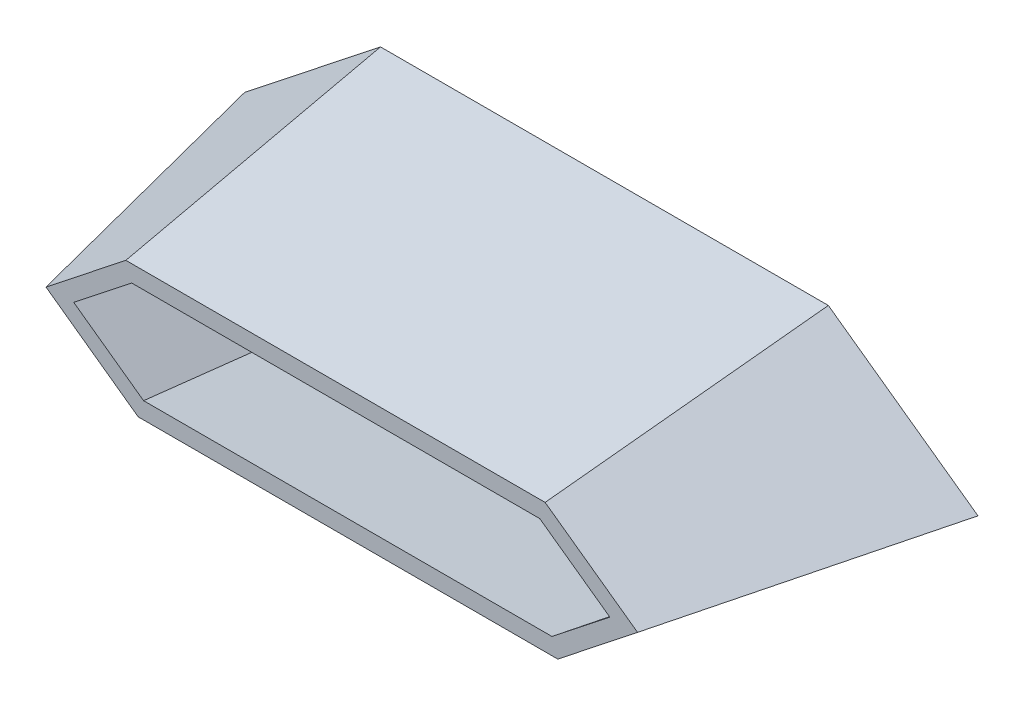
ISO-10303-21;
HEADER;
FILE_DESCRIPTION(('STEP AP214'),'2;1');
FILE_NAME('part.step','',(''),(''),'','','');
FILE_SCHEMA(('AUTOMOTIVE_DESIGN { 1 0 10303 214 1 1 1 1 }'));
ENDSEC;
DATA;
#1=APPLICATION_CONTEXT('core data for automotive mechanical design processes');
#2=APPLICATION_PROTOCOL_DEFINITION('international standard','automotive_design',2000,#1);
#3=PRODUCT_CONTEXT('',#1,'mechanical');
#4=PRODUCT('Part','Part','',(#3));
#5=PRODUCT_RELATED_PRODUCT_CATEGORY('part','',(#4));
#6=PRODUCT_DEFINITION_FORMATION('','',#4);
#7=PRODUCT_DEFINITION_CONTEXT('part definition',#1,'design');
#8=PRODUCT_DEFINITION('design','',#6,#7);
#9=PRODUCT_DEFINITION_SHAPE('','',#8);
#10=(LENGTH_UNIT() NAMED_UNIT(*) SI_UNIT(.MILLI.,.METRE.));
#11=(NAMED_UNIT(*) PLANE_ANGLE_UNIT() SI_UNIT($,.RADIAN.));
#12=(NAMED_UNIT(*) SI_UNIT($,.STERADIAN.) SOLID_ANGLE_UNIT());
#13=UNCERTAINTY_MEASURE_WITH_UNIT(LENGTH_MEASURE(1.E-05),#10,'distance_accuracy_value','');
#14=(GEOMETRIC_REPRESENTATION_CONTEXT(3) GLOBAL_UNCERTAINTY_ASSIGNED_CONTEXT((#13)) GLOBAL_UNIT_ASSIGNED_CONTEXT((#10,
#11,#12)) REPRESENTATION_CONTEXT('',''));
#15=CARTESIAN_POINT('',(0.,0.,0.));
#16=DIRECTION('',(0.,0.,1.));
#17=DIRECTION('',(1.,0.,0.));
#18=AXIS2_PLACEMENT_3D('',#15,#16,#17);
#19=CARTESIAN_POINT('',(0.,0.,14.6));
#20=DIRECTION('',(0.,0.,1.));
#21=DIRECTION('',(1.,0.,0.));
#22=AXIS2_PLACEMENT_3D('',#19,#20,#21);
#23=PLANE('',#22);
#24=DIRECTION('',(-0.784634745814211,-0.619958317680365,0.));
#25=VECTOR('',#24,1.);
#26=CARTESIAN_POINT('',(-10.7814587846776,3.07737881996656,14.6));
#27=LINE('',#26,#25);
#28=CARTESIAN_POINT('',(-11.3858542995684,2.59983174647262,14.6));
#29=VERTEX_POINT('',#28);
#30=CARTESIAN_POINT('',(-14.523223102529,0.120923062651897,14.6));
#31=VERTEX_POINT('',#30);
#32=EDGE_CURVE('E358',#29,#31,#27,.T.);
#33=ORIENTED_EDGE('',*,*,#32,.F.);
#34=DIRECTION('',(-1.,0.,0.));
#35=VECTOR('',#34,1.);
#36=CARTESIAN_POINT('',(11.4365663707456,2.59983174647262,14.6));
#37=LINE('',#36,#35);
#38=CARTESIAN_POINT('',(10.7233829470702,2.59983174647262,14.6));
#39=VERTEX_POINT('',#38);
#40=EDGE_CURVE('E354',#39,#29,#37,.T.);
#41=ORIENTED_EDGE('',*,*,#40,.F.);
#42=DIRECTION('',(-0.812500733959519,0.582960167863331,0.));
#43=VECTOR('',#42,1.);
#44=CARTESIAN_POINT('',(16.9115645353516,-1.84011916888623,14.6));
#45=LINE('',#44,#43);
#46=CARTESIAN_POINT('',(14.5195166433071,-0.12385162302473,14.6));
#47=VERTEX_POINT('',#46);
#48=EDGE_CURVE('E372',#47,#39,#45,.T.);
#49=ORIENTED_EDGE('',*,*,#48,.F.);
#50=DIRECTION('',(0.78463474581421,0.619958317680366,0.));
#51=VECTOR('',#50,1.);
#52=CARTESIAN_POINT('',(10.7814587846776,-3.07737881996657,14.6));
#53=LINE('',#52,#51);
#54=CARTESIAN_POINT('',(11.3858542995684,-2.59983174647262,14.6));
#55=VERTEX_POINT('',#54);
#56=EDGE_CURVE('E390',#55,#47,#53,.T.);
#57=ORIENTED_EDGE('',*,*,#56,.F.);
#58=DIRECTION('',(1.,0.,0.));
#59=VECTOR('',#58,1.);
#60=CARTESIAN_POINT('',(-11.4541582602206,-2.59983174647262,14.6));
#61=LINE('',#60,#59);
#62=CARTESIAN_POINT('',(-10.7396734460902,-2.59983174647262,14.6));
#63=VERTEX_POINT('',#62);
#64=EDGE_CURVE('E394',#63,#55,#61,.T.);
#65=ORIENTED_EDGE('',*,*,#64,.F.);
#66=DIRECTION('',(0.811880248653877,-0.583823999032001,0.));
#67=VECTOR('',#66,1.);
#68=CARTESIAN_POINT('',(-16.9108011023936,1.83783308502642,14.6));
#69=LINE('',#68,#67);
#70=EDGE_CURVE('E397',#31,#63,#69,.T.);
#71=ORIENTED_EDGE('',*,*,#70,.F.);
#72=EDGE_LOOP('',(#33,#41,#49,#57,#65,#71));
#73=FACE_BOUND('',#72,.T.);
#74=DIRECTION('',(-0.78463474581421,-0.619958317680366,0.));
#75=VECTOR('',#74,1.);
#76=CARTESIAN_POINT('',(6.20184152021513,-7.84920567402225,14.6));
#77=LINE('',#76,#75);
#78=CARTESIAN_POINT('',(11.7002285816416,-3.5048010822779,14.6));
#79=VERTEX_POINT('',#78);
#80=CARTESIAN_POINT('',(16.0233325239582,-0.0890152513116378,14.6));
#81=VERTEX_POINT('',#80);
#82=EDGE_CURVE('E290',#79,#81,#77,.F.);
#83=ORIENTED_EDGE('',*,*,#82,.T.);
#84=DIRECTION('',(0.812500733959519,-0.582960167863331,0.));
#85=VECTOR('',#84,1.);
#86=CARTESIAN_POINT('',(5.40324773256688,7.5307765272651,14.6));
#87=LINE('',#86,#85);
#88=CARTESIAN_POINT('',(11.0144510090178,3.5048010822779,14.6));
#89=VERTEX_POINT('',#88);
#90=EDGE_CURVE('E12',#81,#89,#87,.F.);
#91=ORIENTED_EDGE('',*,*,#90,.T.);
#92=DIRECTION('',(1.,0.,0.));
#93=VECTOR('',#92,1.);
#94=CARTESIAN_POINT('',(0.,3.5048010822779,14.6));
#95=LINE('',#94,#93);
#96=CARTESIAN_POINT('',(-11.7002285816416,3.50480108227789,14.6));
#97=VERTEX_POINT('',#96);
#98=EDGE_CURVE('E184',#89,#97,#95,.F.);
#99=ORIENTED_EDGE('',*,*,#98,.T.);
#100=DIRECTION('',(0.784634745814211,0.619958317680365,0.));
#101=VECTOR('',#100,1.);
#102=CARTESIAN_POINT('',(-6.20184152021511,7.84920567402224,14.6));
#103=LINE('',#102,#101);
#104=CARTESIAN_POINT('',(-16.0259964486695,0.0869104219101166,14.6));
#105=VERTEX_POINT('',#104);
#106=EDGE_CURVE('E339',#97,#105,#103,.F.);
#107=ORIENTED_EDGE('',*,*,#106,.T.);
#108=DIRECTION('',(-0.811880248653877,0.583823999032001,0.));
#109=VECTOR('',#108,1.);
#110=CARTESIAN_POINT('',(-5.42127317055424,-7.53895800280199,14.6));
#111=LINE('',#110,#109);
#112=CARTESIAN_POINT('',(-11.0312726381581,-3.5048010822779,14.6));
#113=VERTEX_POINT('',#112);
#114=EDGE_CURVE('E335',#105,#113,#111,.F.);
#115=ORIENTED_EDGE('',*,*,#114,.T.);
#116=DIRECTION('',(-1.,0.,0.));
#117=VECTOR('',#116,1.);
#118=CARTESIAN_POINT('',(0.,-3.5048010822779,14.6));
#119=LINE('',#118,#117);
#120=EDGE_CURVE('E332',#113,#79,#119,.F.);
#121=ORIENTED_EDGE('',*,*,#120,.T.);
#122=EDGE_LOOP('',(#83,#91,#99,#107,#115,#121));
#123=FACE_BOUND('',#122,.T.);
#124=ADVANCED_FACE('F175',(#73,#123),#23,.T.);
#125=CARTESIAN_POINT('',(0.,0.,0.));
#126=DIRECTION('',(0.,0.,-1.));
#127=DIRECTION('',(-1.,0.,0.));
#128=AXIS2_PLACEMENT_3D('',#125,#126,#127);
#129=PLANE('',#128);
#130=DIRECTION('',(0.78463474581421,0.619958317680366,0.));
#131=VECTOR('',#130,1.);
#132=CARTESIAN_POINT('',(12.5035299689139,-5.81721391101613,0.));
#133=LINE('',#132,#131);
#134=CARTESIAN_POINT('',(12.5035299689139,-5.81721391101613,0.));
#135=VERTEX_POINT('',#134);
#136=CARTESIAN_POINT('',(19.8659413250437,0.,0.));
#137=VERTEX_POINT('',#136);
#138=EDGE_CURVE('E287',#135,#137,#133,.T.);
#139=ORIENTED_EDGE('',*,*,#138,.F.);
#140=DIRECTION('',(1.,0.,0.));
#141=VECTOR('',#140,1.);
#142=CARTESIAN_POINT('',(11.9236217699631,-5.81721391101613,0.));
#143=LINE('',#142,#141);
#144=CARTESIAN_POINT('',(-11.7763782300369,-5.81721391101613,0.));
#145=VERTEX_POINT('',#144);
#146=EDGE_CURVE('E298',#145,#135,#143,.T.);
#147=ORIENTED_EDGE('',*,*,#146,.F.);
#148=DIRECTION('',(0.811880248653877,-0.583823999032001,0.));
#149=VECTOR('',#148,1.);
#150=CARTESIAN_POINT('',(-19.8659413250437,0.,0.));
#151=LINE('',#150,#149);
#152=CARTESIAN_POINT('',(-19.8659413250437,0.,0.));
#153=VERTEX_POINT('',#152);
#154=EDGE_CURVE('E304',#153,#145,#151,.T.);
#155=ORIENTED_EDGE('',*,*,#154,.F.);
#156=DIRECTION('',(-0.784634745814211,-0.619958317680365,0.));
#157=VECTOR('',#156,1.);
#158=CARTESIAN_POINT('',(-12.5035299689139,5.81721391101613,0.));
#159=LINE('',#158,#157);
#160=CARTESIAN_POINT('',(-12.5035299689139,5.81721391101613,0.));
#161=VERTEX_POINT('',#160);
#162=EDGE_CURVE('E324',#161,#153,#159,.T.);
#163=ORIENTED_EDGE('',*,*,#162,.F.);
#164=DIRECTION('',(-1.,0.,0.));
#165=VECTOR('',#164,1.);
#166=CARTESIAN_POINT('',(11.758199436565,5.81721391101613,0.));
#167=LINE('',#166,#165);
#168=CARTESIAN_POINT('',(11.758199436565,5.81721391101613,0.));
#169=VERTEX_POINT('',#168);
#170=EDGE_CURVE('E315',#169,#161,#167,.T.);
#171=ORIENTED_EDGE('',*,*,#170,.F.);
#172=DIRECTION('',(-0.812500733959519,0.582960167863331,0.));
#173=VECTOR('',#172,1.);
#174=CARTESIAN_POINT('',(19.8659413250437,0.,0.));
#175=LINE('',#174,#173);
#176=EDGE_CURVE('E309',#137,#169,#175,.T.);
#177=ORIENTED_EDGE('',*,*,#176,.F.);
#178=EDGE_LOOP('',(#139,#147,#155,#163,#171,#177));
#179=FACE_BOUND('',#178,.T.);
#180=DIRECTION('',(1.,0.,0.));
#181=VECTOR('',#180,1.);
#182=CARTESIAN_POINT('',(0.,-4.81721391101613,0.));
#183=LINE('',#182,#181);
#184=CARTESIAN_POINT('',(-11.4541582602206,-4.81721391101613,0.));
#185=VERTEX_POINT('',#184);
#186=CARTESIAN_POINT('',(12.1561433010625,-4.81721391101613,0.));
#187=VERTEX_POINT('',#186);
#188=EDGE_CURVE('E407',#185,#187,#183,.T.);
#189=ORIENTED_EDGE('',*,*,#188,.T.);
#190=DIRECTION('',(0.784634745814211,0.619958317680366,0.));
#191=VECTOR('',#190,1.);
#192=CARTESIAN_POINT('',(7.01548276962181,-8.87897038030258,0.));
#193=LINE('',#192,#191);
#194=CARTESIAN_POINT('',(18.204210014211,-0.0384945327258834,0.));
#195=VERTEX_POINT('',#194);
#196=EDGE_CURVE('E199',#187,#195,#193,.T.);
#197=ORIENTED_EDGE('',*,*,#196,.T.);
#198=DIRECTION('',(-0.812500733959519,0.582960167863331,0.));
#199=VECTOR('',#198,1.);
#200=CARTESIAN_POINT('',(6.16833213551411,8.5971129138728,0.));
#201=LINE('',#200,#199);
#202=CARTESIAN_POINT('',(11.4365663707456,4.81721391101613,0.));
#203=VERTEX_POINT('',#202);
#204=EDGE_CURVE('E430',#195,#203,#201,.T.);
#205=ORIENTED_EDGE('',*,*,#204,.T.);
#206=DIRECTION('',(-1.,0.,0.));
#207=VECTOR('',#206,1.);
#208=CARTESIAN_POINT('',(0.,4.81721391101613,0.));
#209=LINE('',#208,#207);
#210=CARTESIAN_POINT('',(-12.1561433010625,4.81721391101613,0.));
#211=VERTEX_POINT('',#210);
#212=EDGE_CURVE('E434',#203,#211,#209,.T.);
#213=ORIENTED_EDGE('',*,*,#212,.T.);
#214=DIRECTION('',(-0.784634745814211,-0.619958317680365,0.));
#215=VECTOR('',#214,1.);
#216=CARTESIAN_POINT('',(-7.01548276962179,8.87897038030258,0.));
#217=LINE('',#216,#215);
#218=CARTESIAN_POINT('',(-18.2053620250796,0.0375843019161658,0.));
#219=VERTEX_POINT('',#218);
#220=EDGE_CURVE('E438',#211,#219,#217,.T.);
#221=ORIENTED_EDGE('',*,*,#220,.T.);
#222=DIRECTION('',(0.811880248653877,-0.583823999032002,0.));
#223=VECTOR('',#222,1.);
#224=CARTESIAN_POINT('',(-6.1874912766091,-8.60448005653453,0.));
#225=LINE('',#224,#223);
#226=EDGE_CURVE('E442',#219,#185,#225,.T.);
#227=ORIENTED_EDGE('',*,*,#226,.T.);
#228=EDGE_LOOP('',(#189,#197,#205,#213,#221,#227));
#229=FACE_BOUND('',#228,.T.);
#230=ADVANCED_FACE('F177',(#179,#229),#129,.T.);
#231=CARTESIAN_POINT('',(7.01548276962181,-8.87897038030258,0.6));
#232=DIRECTION('',(-0.619958317680366,0.78463474581421,0.));
#233=DIRECTION('',(-0.78463474581421,-0.619958317680366,0.));
#234=AXIS2_PLACEMENT_3D('',#231,#232,#233);
#235=PLANE('',#234);
#236=ORIENTED_EDGE('',*,*,#196,.F.);
#237=DIRECTION('',(0.,0.,-1.));
#238=VECTOR('',#237,1.);
#239=CARTESIAN_POINT('',(12.1561433010625,-4.81721391101613,0.6));
#240=LINE('',#239,#238);
#241=CARTESIAN_POINT('',(12.1561433010625,-4.81721391101613,0.6));
#242=VERTEX_POINT('',#241);
#243=EDGE_CURVE('E427',#242,#187,#240,.T.);
#244=ORIENTED_EDGE('',*,*,#243,.F.);
#245=DIRECTION('',(0.784634745814211,0.619958317680366,0.));
#246=VECTOR('',#245,1.);
#247=CARTESIAN_POINT('',(7.01548276962181,-8.87897038030258,0.6));
#248=LINE('',#247,#246);
#249=CARTESIAN_POINT('',(18.204210014211,-0.0384945327258834,0.6));
#250=VERTEX_POINT('',#249);
#251=EDGE_CURVE('E402',#242,#250,#248,.T.);
#252=ORIENTED_EDGE('',*,*,#251,.T.);
#253=DIRECTION('',(0.,0.,-1.));
#254=VECTOR('',#253,1.);
#255=CARTESIAN_POINT('',(18.204210014211,-0.0384945327258834,0.6));
#256=LINE('',#255,#254);
#257=EDGE_CURVE('E311',#250,#195,#256,.T.);
#258=ORIENTED_EDGE('',*,*,#257,.T.);
#259=EDGE_LOOP('',(#236,#244,#252,#258));
#260=FACE_BOUND('',#259,.T.);
#261=ADVANCED_FACE('F504',(#260),#235,.T.);
#262=CARTESIAN_POINT('',(6.16833213551411,8.5971129138728,0.6));
#263=DIRECTION('',(-0.582960167863331,-0.812500733959519,0.));
#264=DIRECTION('',(0.812500733959519,-0.582960167863331,0.));
#265=AXIS2_PLACEMENT_3D('',#262,#263,#264);
#266=PLANE('',#265);
#267=ORIENTED_EDGE('',*,*,#204,.F.);
#268=ORIENTED_EDGE('',*,*,#257,.F.);
#269=DIRECTION('',(-0.812500733959519,0.582960167863331,0.));
#270=VECTOR('',#269,1.);
#271=CARTESIAN_POINT('',(6.16833213551411,8.5971129138728,0.6));
#272=LINE('',#271,#270);
#273=CARTESIAN_POINT('',(11.4365663707456,4.81721391101613,0.6));
#274=VERTEX_POINT('',#273);
#275=EDGE_CURVE('E406',#250,#274,#272,.T.);
#276=ORIENTED_EDGE('',*,*,#275,.T.);
#277=DIRECTION('',(0.,0.,-1.));
#278=VECTOR('',#277,1.);
#279=CARTESIAN_POINT('',(11.4365663707456,4.81721391101613,0.6));
#280=LINE('',#279,#278);
#281=EDGE_CURVE('E317',#274,#203,#280,.T.);
#282=ORIENTED_EDGE('',*,*,#281,.T.);
#283=EDGE_LOOP('',(#267,#268,#276,#282));
#284=FACE_BOUND('',#283,.T.);
#285=ADVANCED_FACE('F464',(#284),#266,.T.);
#286=CARTESIAN_POINT('',(0.,4.81721391101613,0.6));
#287=DIRECTION('',(0.,-1.,0.));
#288=DIRECTION('',(0.,0.,-1.));
#289=AXIS2_PLACEMENT_3D('',#286,#287,#288);
#290=PLANE('',#289);
#291=ORIENTED_EDGE('',*,*,#212,.F.);
#292=ORIENTED_EDGE('',*,*,#281,.F.);
#293=DIRECTION('',(-1.,0.,0.));
#294=VECTOR('',#293,1.);
#295=CARTESIAN_POINT('',(0.,4.81721391101613,0.6));
#296=LINE('',#295,#294);
#297=CARTESIAN_POINT('',(-12.1561433010625,4.81721391101613,0.6));
#298=VERTEX_POINT('',#297);
#299=EDGE_CURVE('E411',#274,#298,#296,.T.);
#300=ORIENTED_EDGE('',*,*,#299,.T.);
#301=DIRECTION('',(0.,0.,-1.));
#302=VECTOR('',#301,1.);
#303=CARTESIAN_POINT('',(-12.1561433010625,4.81721391101613,0.6));
#304=LINE('',#303,#302);
#305=EDGE_CURVE('E458',#298,#211,#304,.T.);
#306=ORIENTED_EDGE('',*,*,#305,.T.);
#307=EDGE_LOOP('',(#291,#292,#300,#306));
#308=FACE_BOUND('',#307,.T.);
#309=ADVANCED_FACE('F468',(#308),#290,.T.);
#310=CARTESIAN_POINT('',(-7.01548276962179,8.87897038030258,0.6));
#311=DIRECTION('',(0.619958317680365,-0.784634745814211,0.));
#312=DIRECTION('',(0.784634745814211,0.619958317680365,0.));
#313=AXIS2_PLACEMENT_3D('',#310,#311,#312);
#314=PLANE('',#313);
#315=ORIENTED_EDGE('',*,*,#220,.F.);
#316=ORIENTED_EDGE('',*,*,#305,.F.);
#317=DIRECTION('',(-0.784634745814211,-0.619958317680365,0.));
#318=VECTOR('',#317,1.);
#319=CARTESIAN_POINT('',(-7.01548276962179,8.87897038030258,0.6));
#320=LINE('',#319,#318);
#321=CARTESIAN_POINT('',(-18.2053620250796,0.0375843019161658,0.6));
#322=VERTEX_POINT('',#321);
#323=EDGE_CURVE('E415',#298,#322,#320,.T.);
#324=ORIENTED_EDGE('',*,*,#323,.T.);
#325=DIRECTION('',(0.,0.,-1.));
#326=VECTOR('',#325,1.);
#327=CARTESIAN_POINT('',(-18.2053620250796,0.0375843019161658,0.6));
#328=LINE('',#327,#326);
#329=EDGE_CURVE('E455',#322,#219,#328,.T.);
#330=ORIENTED_EDGE('',*,*,#329,.T.);
#331=EDGE_LOOP('',(#315,#316,#324,#330));
#332=FACE_BOUND('',#331,.T.);
#333=ADVANCED_FACE('F486',(#332),#314,.T.);
#334=CARTESIAN_POINT('',(-6.1874912766091,-8.60448005653453,0.6));
#335=DIRECTION('',(0.583823999032001,0.811880248653877,0.));
#336=DIRECTION('',(-0.811880248653877,0.583823999032002,0.));
#337=AXIS2_PLACEMENT_3D('',#334,#335,#336);
#338=PLANE('',#337);
#339=ORIENTED_EDGE('',*,*,#226,.F.);
#340=ORIENTED_EDGE('',*,*,#329,.F.);
#341=DIRECTION('',(0.811880248653877,-0.583823999032002,0.));
#342=VECTOR('',#341,1.);
#343=CARTESIAN_POINT('',(-6.1874912766091,-8.60448005653453,0.6));
#344=LINE('',#343,#342);
#345=CARTESIAN_POINT('',(-11.4541582602206,-4.81721391101613,0.6));
#346=VERTEX_POINT('',#345);
#347=EDGE_CURVE('E419',#322,#346,#344,.T.);
#348=ORIENTED_EDGE('',*,*,#347,.T.);
#349=DIRECTION('',(0.,0.,-1.));
#350=VECTOR('',#349,1.);
#351=CARTESIAN_POINT('',(-11.4541582602206,-4.81721391101613,0.6));
#352=LINE('',#351,#350);
#353=EDGE_CURVE('E451',#346,#185,#352,.T.);
#354=ORIENTED_EDGE('',*,*,#353,.T.);
#355=EDGE_LOOP('',(#339,#340,#348,#354));
#356=FACE_BOUND('',#355,.T.);
#357=ADVANCED_FACE('F476',(#356),#338,.T.);
#358=CARTESIAN_POINT('',(0.,-4.81721391101613,0.6));
#359=DIRECTION('',(0.,1.,0.));
#360=DIRECTION('',(0.,0.,1.));
#361=AXIS2_PLACEMENT_3D('',#358,#359,#360);
#362=PLANE('',#361);
#363=ORIENTED_EDGE('',*,*,#188,.F.);
#364=ORIENTED_EDGE('',*,*,#353,.F.);
#365=DIRECTION('',(1.,0.,0.));
#366=VECTOR('',#365,1.);
#367=CARTESIAN_POINT('',(0.,-4.81721391101613,0.6));
#368=LINE('',#367,#366);
#369=EDGE_CURVE('E423',#346,#242,#368,.T.);
#370=ORIENTED_EDGE('',*,*,#369,.T.);
#371=ORIENTED_EDGE('',*,*,#243,.T.);
#372=EDGE_LOOP('',(#363,#364,#370,#371));
#373=FACE_BOUND('',#372,.T.);
#374=ADVANCED_FACE('F474',(#373),#362,.T.);
#375=CARTESIAN_POINT('',(11.4365663707456,4.81721391101613,0.6));
#376=DIRECTION('',(0.,-0.987688340595138,-0.156434465040231));
#377=DIRECTION('',(0.,0.156434465040231,-0.987688340595138));
#378=AXIS2_PLACEMENT_3D('',#375,#376,#377);
#379=PLANE('',#378);
#380=ORIENTED_EDGE('',*,*,#299,.F.);
#381=DIRECTION('',(0.0502509304599641,0.156236829481266,-0.98644051878537));
#382=VECTOR('',#381,1.);
#383=CARTESIAN_POINT('',(11.4365663707456,4.81721391101613,0.6));
#384=LINE('',#383,#382);
#385=EDGE_CURVE('E368',#39,#274,#384,.T.);
#386=ORIENTED_EDGE('',*,*,#385,.F.);
#387=ORIENTED_EDGE('',*,*,#40,.T.);
#388=DIRECTION('',(-0.0542631819122418,0.156203985166874,-0.98623314794563));
#389=VECTOR('',#388,1.);
#390=CARTESIAN_POINT('',(-12.1561433010625,4.81721391101613,0.6));
#391=LINE('',#390,#389);
#392=EDGE_CURVE('E373',#29,#298,#391,.T.);
#393=ORIENTED_EDGE('',*,*,#392,.T.);
#394=EDGE_LOOP('',(#380,#386,#387,#393));
#395=FACE_BOUND('',#394,.T.);
#396=ADVANCED_FACE('F493',(#395),#379,.T.);
#397=CARTESIAN_POINT('',(-12.1561433010625,4.81721391101613,0.6));
#398=DIRECTION('',(0.612325602027873,-0.774974590066526,-0.156434465040231));
#399=DIRECTION('',(0.784634745814211,0.619958317680365,0.));
#400=AXIS2_PLACEMENT_3D('',#397,#398,#399);
#401=PLANE('',#400);
#402=ORIENTED_EDGE('',*,*,#323,.F.);
#403=ORIENTED_EDGE('',*,*,#392,.F.);
#404=ORIENTED_EDGE('',*,*,#32,.T.);
#405=DIRECTION('',(-0.254355245430828,-0.00575688516558048,-0.967093722136078));
#406=VECTOR('',#405,1.);
#407=CARTESIAN_POINT('',(-18.2053620250796,0.0375843019161658,0.6));
#408=LINE('',#407,#406);
#409=EDGE_CURVE('E377',#31,#322,#408,.T.);
#410=ORIENTED_EDGE('',*,*,#409,.T.);
#411=EDGE_LOOP('',(#402,#403,#404,#410));
#412=FACE_BOUND('',#411,.T.);
#413=ADVANCED_FACE('F489',(#412),#401,.T.);
#414=CARTESIAN_POINT('',(-18.2053620250796,0.0375843019161658,0.6));
#415=DIRECTION('',(0.576636156803535,0.801884655554916,-0.156434465040231));
#416=DIRECTION('',(-0.811880248653877,0.583823999032001,0.));
#417=AXIS2_PLACEMENT_3D('',#414,#415,#416);
#418=PLANE('',#417);
#419=ORIENTED_EDGE('',*,*,#347,.F.);
#420=ORIENTED_EDGE('',*,*,#409,.F.);
#421=ORIENTED_EDGE('',*,*,#70,.T.);
#422=DIRECTION('',(-0.0503423943003364,-0.156236108919745,-0.986435969338977));
#423=VECTOR('',#422,1.);
#424=CARTESIAN_POINT('',(-11.4541582602206,-4.81721391101613,0.6));
#425=LINE('',#424,#423);
#426=EDGE_CURVE('E380',#63,#346,#425,.T.);
#427=ORIENTED_EDGE('',*,*,#426,.T.);
#428=EDGE_LOOP('',(#419,#420,#421,#427));
#429=FACE_BOUND('',#428,.T.);
#430=ADVANCED_FACE('F481',(#429),#418,.T.);
#431=CARTESIAN_POINT('',(-11.4541582602206,-4.81721391101613,0.6));
#432=DIRECTION('',(0.,0.987688340595138,-0.156434465040231));
#433=DIRECTION('',(0.,0.156434465040231,0.987688340595138));
#434=AXIS2_PLACEMENT_3D('',#431,#432,#433);
#435=PLANE('',#434);
#436=ORIENTED_EDGE('',*,*,#369,.F.);
#437=ORIENTED_EDGE('',*,*,#426,.F.);
#438=ORIENTED_EDGE('',*,*,#64,.T.);
#439=DIRECTION('',(0.0542631819122419,-0.156203985166874,-0.986233147945629));
#440=VECTOR('',#439,1.);
#441=CARTESIAN_POINT('',(12.1561433010625,-4.81721391101613,0.6));
#442=LINE('',#441,#440);
#443=EDGE_CURVE('E383',#55,#242,#442,.T.);
#444=ORIENTED_EDGE('',*,*,#443,.T.);
#445=EDGE_LOOP('',(#436,#437,#438,#444));
#446=FACE_BOUND('',#445,.T.);
#447=ADVANCED_FACE('F501',(#446),#435,.T.);
#448=CARTESIAN_POINT('',(12.1561433010625,-4.81721391101613,0.6));
#449=DIRECTION('',(-0.612325602027874,0.774974590066525,-0.156434465040231));
#450=DIRECTION('',(-0.78463474581421,-0.619958317680366,0.));
#451=AXIS2_PLACEMENT_3D('',#448,#449,#450);
#452=PLANE('',#451);
#453=ORIENTED_EDGE('',*,*,#251,.F.);
#454=ORIENTED_EDGE('',*,*,#443,.F.);
#455=ORIENTED_EDGE('',*,*,#56,.T.);
#456=DIRECTION('',(0.254520067938857,0.00589603807835875,-0.967049518769012));
#457=VECTOR('',#456,1.);
#458=CARTESIAN_POINT('',(18.204210014211,-0.0384945327258834,0.6));
#459=LINE('',#458,#457);
#460=EDGE_CURVE('E371',#47,#250,#459,.T.);
#461=ORIENTED_EDGE('',*,*,#460,.T.);
#462=EDGE_LOOP('',(#453,#454,#455,#461));
#463=FACE_BOUND('',#462,.T.);
#464=ADVANCED_FACE('F506',(#463),#452,.T.);
#465=CARTESIAN_POINT('',(18.204210014211,-0.0384945327258834,0.6));
#466=DIRECTION('',(-0.575782960829997,-0.802497501656808,-0.156434465040231));
#467=DIRECTION('',(0.812500733959519,-0.582960167863331,0.));
#468=AXIS2_PLACEMENT_3D('',#465,#466,#467);
#469=PLANE('',#468);
#470=ORIENTED_EDGE('',*,*,#275,.F.);
#471=ORIENTED_EDGE('',*,*,#460,.F.);
#472=ORIENTED_EDGE('',*,*,#48,.T.);
#473=ORIENTED_EDGE('',*,*,#385,.T.);
#474=EDGE_LOOP('',(#470,#471,#472,#473));
#475=FACE_BOUND('',#474,.T.);
#476=ADVANCED_FACE('F508',(#475),#469,.T.);
#477=CARTESIAN_POINT('',(11.758199436565,5.81721391101613,0.));
#478=DIRECTION('',(-0.575782960829997,-0.802497501656808,-0.156434465040231));
#479=DIRECTION('',(0.812500733959519,-0.582960167863331,0.));
#480=AXIS2_PLACEMENT_3D('',#477,#478,#479);
#481=PLANE('',#480);
#482=DIRECTION('',(0.254520067938857,0.00589603807835872,-0.967049518769012));
#483=VECTOR('',#482,1.);
#484=CARTESIAN_POINT('',(19.3494476958402,-0.0119647386929884,1.96241860067612));
#485=LINE('',#484,#483);
#486=EDGE_CURVE('E191',#81,#137,#485,.T.);
#487=ORIENTED_EDGE('',*,*,#486,.T.);
#488=ORIENTED_EDGE('',*,*,#176,.T.);
#489=DIRECTION('',(0.050250930459964,0.156236829481266,-0.98644051878537));
#490=VECTOR('',#489,1.);
#491=CARTESIAN_POINT('',(11.696934784693,5.62673395611498,1.20264310377233));
#492=LINE('',#491,#490);
#493=EDGE_CURVE('E349',#89,#169,#492,.T.);
#494=ORIENTED_EDGE('',*,*,#493,.F.);
#495=ORIENTED_EDGE('',*,*,#90,.F.);
#496=EDGE_LOOP('',(#487,#488,#494,#495));
#497=FACE_BOUND('',#496,.T.);
#498=ADVANCED_FACE('F352',(#497),#481,.F.);
#499=CARTESIAN_POINT('',(-12.5035299689139,5.81721391101613,0.));
#500=DIRECTION('',(0.,-0.987688340595138,-0.156434465040231));
#501=DIRECTION('',(0.,0.156434465040231,-0.987688340595138));
#502=AXIS2_PLACEMENT_3D('',#499,#500,#501);
#503=PLANE('',#502);
#504=ORIENTED_EDGE('',*,*,#493,.T.);
#505=ORIENTED_EDGE('',*,*,#170,.T.);
#506=DIRECTION('',(-0.0542631819122418,0.156203985166874,-0.98623314794563));
#507=VECTOR('',#506,1.);
#508=CARTESIAN_POINT('',(-12.475901103173,5.73768044500316,0.502154541506737));
#509=LINE('',#508,#507);
#510=EDGE_CURVE('E350',#97,#161,#509,.T.);
#511=ORIENTED_EDGE('',*,*,#510,.F.);
#512=ORIENTED_EDGE('',*,*,#98,.F.);
#513=EDGE_LOOP('',(#504,#505,#511,#512));
#514=FACE_BOUND('',#513,.T.);
#515=ADVANCED_FACE('F348',(#514),#503,.F.);
#516=CARTESIAN_POINT('',(-19.8659413250437,0.,0.));
#517=DIRECTION('',(0.612325602027873,-0.774974590066526,-0.156434465040231));
#518=DIRECTION('',(0.784634745814211,0.619958317680365,0.));
#519=AXIS2_PLACEMENT_3D('',#516,#517,#518);
#520=PLANE('',#519);
#521=ORIENTED_EDGE('',*,*,#510,.T.);
#522=ORIENTED_EDGE('',*,*,#162,.T.);
#523=DIRECTION('',(-0.254355245430828,-0.00575688516558048,-0.967093722136078));
#524=VECTOR('',#523,1.);
#525=CARTESIAN_POINT('',(-19.3510922821758,0.0116527056966279,1.95752706558864));
#526=LINE('',#525,#524);
#527=EDGE_CURVE('E360',#105,#153,#526,.T.);
#528=ORIENTED_EDGE('',*,*,#527,.F.);
#529=ORIENTED_EDGE('',*,*,#106,.F.);
#530=EDGE_LOOP('',(#521,#522,#528,#529));
#531=FACE_BOUND('',#530,.T.);
#532=ADVANCED_FACE('F576',(#531),#520,.F.);
#533=CARTESIAN_POINT('',(-11.7763782300369,-5.81721391101613,0.));
#534=DIRECTION('',(0.576636156803535,0.801884655554916,-0.156434465040231));
#535=DIRECTION('',(-0.811880248653877,0.583823999032001,0.));
#536=AXIS2_PLACEMENT_3D('',#533,#534,#535);
#537=PLANE('',#536);
#538=ORIENTED_EDGE('',*,*,#527,.T.);
#539=ORIENTED_EDGE('',*,*,#154,.T.);
#540=DIRECTION('',(-0.0503423943003364,-0.156236108919745,-0.986435969338977));
#541=VECTOR('',#540,1.);
#542=CARTESIAN_POINT('',(-11.7148442828943,-5.62624515393461,1.20572927927902));
#543=LINE('',#542,#541);
#544=EDGE_CURVE('E294',#113,#145,#543,.T.);
#545=ORIENTED_EDGE('',*,*,#544,.F.);
#546=ORIENTED_EDGE('',*,*,#114,.F.);
#547=EDGE_LOOP('',(#538,#539,#545,#546));
#548=FACE_BOUND('',#547,.T.);
#549=ADVANCED_FACE('F586',(#548),#537,.F.);
#550=CARTESIAN_POINT('',(12.5035299689139,-5.81721391101613,0.));
#551=DIRECTION('',(0.,0.987688340595138,-0.156434465040231));
#552=DIRECTION('',(0.,0.156434465040231,0.987688340595138));
#553=AXIS2_PLACEMENT_3D('',#550,#551,#552);
#554=PLANE('',#553);
#555=ORIENTED_EDGE('',*,*,#544,.T.);
#556=ORIENTED_EDGE('',*,*,#146,.T.);
#557=DIRECTION('',(0.0542631819122419,-0.156203985166874,-0.98623314794563));
#558=VECTOR('',#557,1.);
#559=CARTESIAN_POINT('',(12.475901103173,-5.73768044500316,0.502154541506738));
#560=LINE('',#559,#558);
#561=EDGE_CURVE('E283',#79,#135,#560,.T.);
#562=ORIENTED_EDGE('',*,*,#561,.F.);
#563=ORIENTED_EDGE('',*,*,#120,.F.);
#564=EDGE_LOOP('',(#555,#556,#562,#563));
#565=FACE_BOUND('',#564,.T.);
#566=ADVANCED_FACE('F299',(#565),#554,.F.);
#567=CARTESIAN_POINT('',(19.8659413250437,0.,0.));
#568=DIRECTION('',(-0.612325602027874,0.774974590066525,-0.156434465040231));
#569=DIRECTION('',(-0.78463474581421,-0.619958317680366,0.));
#570=AXIS2_PLACEMENT_3D('',#567,#568,#569);
#571=PLANE('',#570);
#572=ORIENTED_EDGE('',*,*,#561,.T.);
#573=ORIENTED_EDGE('',*,*,#138,.T.);
#574=ORIENTED_EDGE('',*,*,#486,.F.);
#575=ORIENTED_EDGE('',*,*,#82,.F.);
#576=EDGE_LOOP('',(#572,#573,#574,#575));
#577=FACE_BOUND('',#576,.T.);
#578=ADVANCED_FACE('F285',(#577),#571,.F.);
#579=CLOSED_SHELL('',(#124,#230,#261,#285,#309,#333,#357,#374,#396,#413,#430,#447,#464,#476,
#498,#515,#532,#549,#566,#578));
#580=MANIFOLD_SOLID_BREP('B2',#579);
#581=ADVANCED_BREP_SHAPE_REPRESENTATION('',(#18,#580),#14);
#582=SHAPE_DEFINITION_REPRESENTATION(#9,#581);
ENDSEC;
END-ISO-10303-21;
